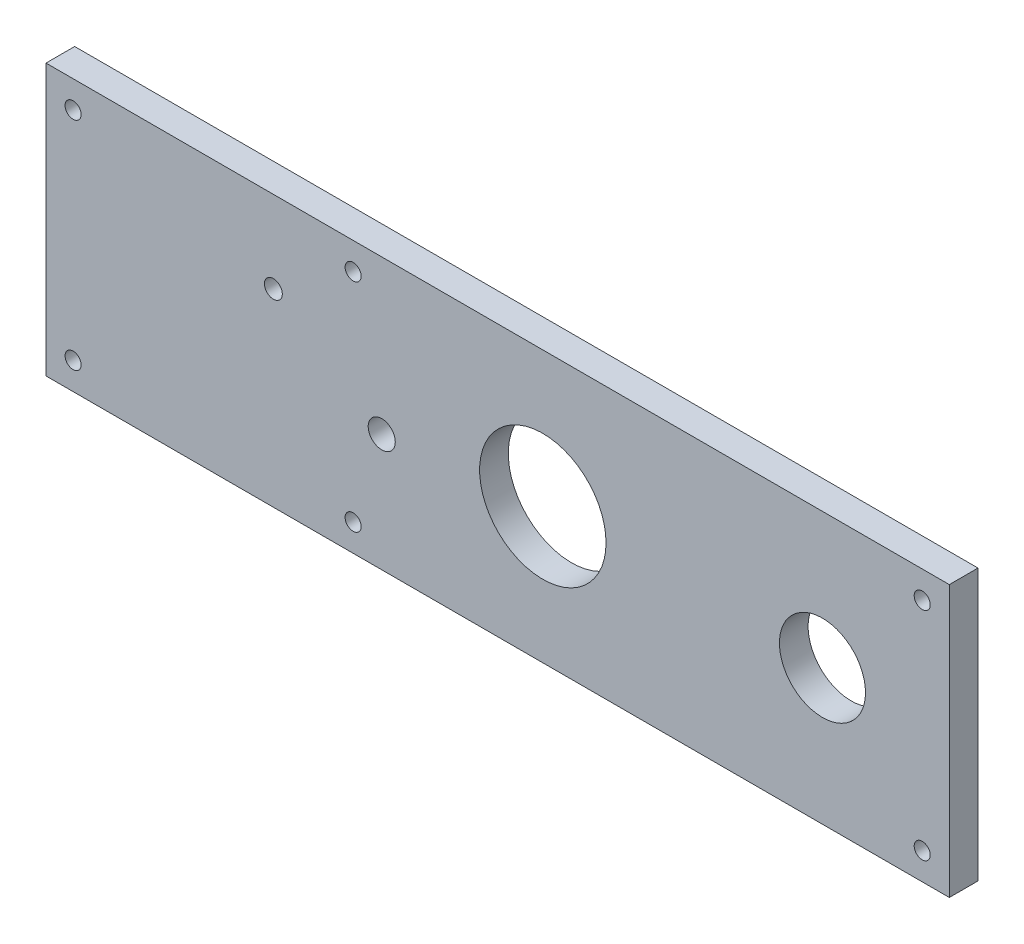
ISO-10303-21;
HEADER;
FILE_DESCRIPTION(('STEP AP214'),'2;1');
FILE_NAME('part.step','',(''),(''),'','','');
FILE_SCHEMA(('AUTOMOTIVE_DESIGN { 1 0 10303 214 1 1 1 1 }'));
ENDSEC;
DATA;
#1=APPLICATION_CONTEXT('core data for automotive mechanical design processes');
#2=APPLICATION_PROTOCOL_DEFINITION('international standard','automotive_design',2000,#1);
#3=PRODUCT_CONTEXT('',#1,'mechanical');
#4=PRODUCT('Part','Part','',(#3));
#5=PRODUCT_RELATED_PRODUCT_CATEGORY('part','',(#4));
#6=PRODUCT_DEFINITION_FORMATION('','',#4);
#7=PRODUCT_DEFINITION_CONTEXT('part definition',#1,'design');
#8=PRODUCT_DEFINITION('design','',#6,#7);
#9=PRODUCT_DEFINITION_SHAPE('','',#8);
#10=(LENGTH_UNIT() NAMED_UNIT(*) SI_UNIT(.MILLI.,.METRE.));
#11=(NAMED_UNIT(*) PLANE_ANGLE_UNIT() SI_UNIT($,.RADIAN.));
#12=(NAMED_UNIT(*) SI_UNIT($,.STERADIAN.) SOLID_ANGLE_UNIT());
#13=UNCERTAINTY_MEASURE_WITH_UNIT(LENGTH_MEASURE(1.E-05),#10,'distance_accuracy_value','');
#14=(GEOMETRIC_REPRESENTATION_CONTEXT(3) GLOBAL_UNCERTAINTY_ASSIGNED_CONTEXT((#13)) GLOBAL_UNIT_ASSIGNED_CONTEXT((#10,
#11,#12)) REPRESENTATION_CONTEXT('',''));
#15=CARTESIAN_POINT('',(0.,0.,0.));
#16=DIRECTION('',(0.,0.,1.));
#17=DIRECTION('',(1.,0.,0.));
#18=AXIS2_PLACEMENT_3D('',#15,#16,#17);
#19=CARTESIAN_POINT('',(0.,0.,3.175));
#20=DIRECTION('',(0.,0.,-1.));
#21=DIRECTION('',(-1.,0.,0.));
#22=AXIS2_PLACEMENT_3D('',#19,#20,#21);
#23=PLANE('',#22);
#24=CARTESIAN_POINT('',(85.9562,15.,3.175));
#25=DIRECTION('',(0.,0.,1.));
#26=DIRECTION('',(1.,0.,0.));
#27=AXIS2_PLACEMENT_3D('',#24,#25,#26);
#28=CIRCLE('',#27,4.7625);
#29=CARTESIAN_POINT('',(90.7187,15.,3.175));
#30=VERTEX_POINT('',#29);
#31=EDGE_CURVE('E165',#30,#30,#28,.T.);
#32=ORIENTED_EDGE('',*,*,#31,.F.);
#33=EDGE_LOOP('',(#32));
#34=FACE_BOUND('',#33,.T.);
#35=CARTESIAN_POINT('',(97.,27.,3.175));
#36=DIRECTION('',(0.,0.,1.));
#37=DIRECTION('',(1.,0.,0.));
#38=AXIS2_PLACEMENT_3D('',#35,#36,#37);
#39=CIRCLE('',#38,0.888999999999987);
#40=CARTESIAN_POINT('',(97.889,27.,3.175));
#41=VERTEX_POINT('',#40);
#42=EDGE_CURVE('E161',#41,#41,#39,.T.);
#43=ORIENTED_EDGE('',*,*,#42,.F.);
#44=EDGE_LOOP('',(#43));
#45=FACE_BOUND('',#44,.T.);
#46=CARTESIAN_POINT('',(97.,3.,3.175));
#47=DIRECTION('',(0.,0.,1.));
#48=DIRECTION('',(1.,0.,0.));
#49=AXIS2_PLACEMENT_3D('',#46,#47,#48);
#50=CIRCLE('',#49,0.888999999999987);
#51=CARTESIAN_POINT('',(97.889,3.,3.175));
#52=VERTEX_POINT('',#51);
#53=EDGE_CURVE('E155',#52,#52,#50,.T.);
#54=ORIENTED_EDGE('',*,*,#53,.F.);
#55=EDGE_LOOP('',(#54));
#56=FACE_BOUND('',#55,.T.);
#57=CARTESIAN_POINT('',(3.,27.,3.175));
#58=DIRECTION('',(0.,0.,1.));
#59=DIRECTION('',(1.,0.,0.));
#60=AXIS2_PLACEMENT_3D('',#57,#58,#59);
#61=CIRCLE('',#60,0.888999999999987);
#62=CARTESIAN_POINT('',(3.88899999999999,27.,3.175));
#63=VERTEX_POINT('',#62);
#64=EDGE_CURVE('E149',#63,#63,#61,.T.);
#65=ORIENTED_EDGE('',*,*,#64,.F.);
#66=EDGE_LOOP('',(#65));
#67=FACE_BOUND('',#66,.T.);
#68=CARTESIAN_POINT('',(3.,3.,3.175));
#69=DIRECTION('',(0.,0.,1.));
#70=DIRECTION('',(1.,0.,0.));
#71=AXIS2_PLACEMENT_3D('',#68,#69,#70);
#72=CIRCLE('',#71,0.888999999999987);
#73=CARTESIAN_POINT('',(3.88899999999999,3.,3.175));
#74=VERTEX_POINT('',#73);
#75=EDGE_CURVE('E143',#74,#74,#72,.T.);
#76=ORIENTED_EDGE('',*,*,#75,.F.);
#77=EDGE_LOOP('',(#76));
#78=FACE_BOUND('',#77,.T.);
#79=CARTESIAN_POINT('',(34.,27.,3.175));
#80=DIRECTION('',(0.,0.,1.));
#81=DIRECTION('',(1.,0.,0.));
#82=AXIS2_PLACEMENT_3D('',#79,#80,#81);
#83=CIRCLE('',#82,0.888999999999987);
#84=CARTESIAN_POINT('',(34.889,27.,3.175));
#85=VERTEX_POINT('',#84);
#86=EDGE_CURVE('E137',#85,#85,#83,.T.);
#87=ORIENTED_EDGE('',*,*,#86,.F.);
#88=EDGE_LOOP('',(#87));
#89=FACE_BOUND('',#88,.T.);
#90=CARTESIAN_POINT('',(34.,3.,3.175));
#91=DIRECTION('',(0.,0.,1.));
#92=DIRECTION('',(1.,0.,0.));
#93=AXIS2_PLACEMENT_3D('',#90,#91,#92);
#94=CIRCLE('',#93,0.888999999999987);
#95=CARTESIAN_POINT('',(34.889,3.,3.175));
#96=VERTEX_POINT('',#95);
#97=EDGE_CURVE('E131',#96,#96,#94,.T.);
#98=ORIENTED_EDGE('',*,*,#97,.F.);
#99=EDGE_LOOP('',(#98));
#100=FACE_BOUND('',#99,.T.);
#101=CARTESIAN_POINT('',(37.1666992956996,13.,3.175));
#102=DIRECTION('',(0.,0.,1.));
#103=DIRECTION('',(1.,0.,0.));
#104=AXIS2_PLACEMENT_3D('',#101,#102,#103);
#105=CIRCLE('',#104,1.49860000000001);
#106=CARTESIAN_POINT('',(38.6652992956997,13.,3.175));
#107=VERTEX_POINT('',#106);
#108=EDGE_CURVE('E114',#107,#107,#105,.T.);
#109=ORIENTED_EDGE('',*,*,#108,.F.);
#110=EDGE_LOOP('',(#109));
#111=FACE_BOUND('',#110,.T.);
#112=DIRECTION('',(0.,-1.,0.));
#113=VECTOR('',#112,1.);
#114=CARTESIAN_POINT('',(0.,0.,3.175));
#115=LINE('',#114,#113);
#116=CARTESIAN_POINT('',(0.,30.,3.175));
#117=VERTEX_POINT('',#116);
#118=CARTESIAN_POINT('',(0.,0.,3.175));
#119=VERTEX_POINT('',#118);
#120=EDGE_CURVE('E84',#117,#119,#115,.T.);
#121=ORIENTED_EDGE('',*,*,#120,.T.);
#122=DIRECTION('',(1.,0.,0.));
#123=VECTOR('',#122,1.);
#124=CARTESIAN_POINT('',(0.,0.,3.175));
#125=LINE('',#124,#123);
#126=CARTESIAN_POINT('',(100.,0.,3.175));
#127=VERTEX_POINT('',#126);
#128=EDGE_CURVE('E79',#119,#127,#125,.T.);
#129=ORIENTED_EDGE('',*,*,#128,.T.);
#130=DIRECTION('',(0.,1.,0.));
#131=VECTOR('',#130,1.);
#132=CARTESIAN_POINT('',(100.,0.,3.175));
#133=LINE('',#132,#131);
#134=CARTESIAN_POINT('',(100.,30.,3.175));
#135=VERTEX_POINT('',#134);
#136=EDGE_CURVE('E82',#127,#135,#133,.T.);
#137=ORIENTED_EDGE('',*,*,#136,.T.);
#138=DIRECTION('',(-1.,0.,0.));
#139=VECTOR('',#138,1.);
#140=CARTESIAN_POINT('',(0.,30.,3.175));
#141=LINE('',#140,#139);
#142=EDGE_CURVE('E49',#135,#117,#141,.T.);
#143=ORIENTED_EDGE('',*,*,#142,.T.);
#144=EDGE_LOOP('',(#121,#129,#137,#143));
#145=FACE_BOUND('',#144,.T.);
#146=CARTESIAN_POINT('',(55.,15.,3.175));
#147=DIRECTION('',(0.,0.,1.));
#148=DIRECTION('',(1.,0.,0.));
#149=AXIS2_PLACEMENT_3D('',#146,#147,#148);
#150=CIRCLE('',#149,6.9977);
#151=CARTESIAN_POINT('',(61.9977,15.,3.175));
#152=VERTEX_POINT('',#151);
#153=EDGE_CURVE('E99',#152,#152,#150,.T.);
#154=ORIENTED_EDGE('',*,*,#153,.F.);
#155=EDGE_LOOP('',(#154));
#156=FACE_BOUND('',#155,.T.);
#157=CARTESIAN_POINT('',(25.1697789659621,20.9334001816327,3.175));
#158=DIRECTION('',(0.,0.,1.));
#159=DIRECTION('',(1.,0.,0.));
#160=AXIS2_PLACEMENT_3D('',#157,#158,#159);
#161=CIRCLE('',#160,0.990600000000001);
#162=CARTESIAN_POINT('',(26.1603789659621,20.9334001816327,3.175));
#163=VERTEX_POINT('',#162);
#164=EDGE_CURVE('E120',#163,#163,#161,.T.);
#165=ORIENTED_EDGE('',*,*,#164,.F.);
#166=EDGE_LOOP('',(#165));
#167=FACE_BOUND('',#166,.T.);
#168=ADVANCED_FACE('F32',(#34,#45,#56,#67,#78,#89,#100,#111,#145,#156,#167),#23,.F.);
#169=CARTESIAN_POINT('',(0.,0.,0.));
#170=DIRECTION('',(0.,0.,-1.));
#171=DIRECTION('',(-1.,0.,0.));
#172=AXIS2_PLACEMENT_3D('',#169,#170,#171);
#173=PLANE('',#172);
#174=CARTESIAN_POINT('',(85.9562,15.,0.));
#175=DIRECTION('',(0.,0.,1.));
#176=DIRECTION('',(1.,0.,0.));
#177=AXIS2_PLACEMENT_3D('',#174,#175,#176);
#178=CIRCLE('',#177,4.7625);
#179=CARTESIAN_POINT('',(90.7187,15.,0.));
#180=VERTEX_POINT('',#179);
#181=EDGE_CURVE('E164',#180,#180,#178,.T.);
#182=ORIENTED_EDGE('',*,*,#181,.T.);
#183=EDGE_LOOP('',(#182));
#184=FACE_BOUND('',#183,.T.);
#185=CARTESIAN_POINT('',(97.,27.,0.));
#186=DIRECTION('',(0.,0.,1.));
#187=DIRECTION('',(1.,0.,0.));
#188=AXIS2_PLACEMENT_3D('',#185,#186,#187);
#189=CIRCLE('',#188,0.889000000000001);
#190=CARTESIAN_POINT('',(97.889,27.,0.));
#191=VERTEX_POINT('',#190);
#192=EDGE_CURVE('E158',#191,#191,#189,.T.);
#193=ORIENTED_EDGE('',*,*,#192,.T.);
#194=EDGE_LOOP('',(#193));
#195=FACE_BOUND('',#194,.T.);
#196=CARTESIAN_POINT('',(97.,3.,0.));
#197=DIRECTION('',(0.,0.,1.));
#198=DIRECTION('',(1.,0.,0.));
#199=AXIS2_PLACEMENT_3D('',#196,#197,#198);
#200=CIRCLE('',#199,0.889000000000001);
#201=CARTESIAN_POINT('',(97.889,3.,0.));
#202=VERTEX_POINT('',#201);
#203=EDGE_CURVE('E152',#202,#202,#200,.T.);
#204=ORIENTED_EDGE('',*,*,#203,.T.);
#205=EDGE_LOOP('',(#204));
#206=FACE_BOUND('',#205,.T.);
#207=CARTESIAN_POINT('',(3.,27.,0.));
#208=DIRECTION('',(0.,0.,1.));
#209=DIRECTION('',(1.,0.,0.));
#210=AXIS2_PLACEMENT_3D('',#207,#208,#209);
#211=CIRCLE('',#210,0.888999999999999);
#212=CARTESIAN_POINT('',(3.889,27.,0.));
#213=VERTEX_POINT('',#212);
#214=EDGE_CURVE('E146',#213,#213,#211,.T.);
#215=ORIENTED_EDGE('',*,*,#214,.T.);
#216=EDGE_LOOP('',(#215));
#217=FACE_BOUND('',#216,.T.);
#218=CARTESIAN_POINT('',(3.,3.,0.));
#219=DIRECTION('',(0.,0.,1.));
#220=DIRECTION('',(1.,0.,0.));
#221=AXIS2_PLACEMENT_3D('',#218,#219,#220);
#222=CIRCLE('',#221,0.888999999999999);
#223=CARTESIAN_POINT('',(3.889,3.,0.));
#224=VERTEX_POINT('',#223);
#225=EDGE_CURVE('E140',#224,#224,#222,.T.);
#226=ORIENTED_EDGE('',*,*,#225,.T.);
#227=EDGE_LOOP('',(#226));
#228=FACE_BOUND('',#227,.T.);
#229=CARTESIAN_POINT('',(34.,27.,0.));
#230=DIRECTION('',(0.,0.,1.));
#231=DIRECTION('',(1.,0.,0.));
#232=AXIS2_PLACEMENT_3D('',#229,#230,#231);
#233=CIRCLE('',#232,0.889000000000001);
#234=CARTESIAN_POINT('',(34.889,27.,0.));
#235=VERTEX_POINT('',#234);
#236=EDGE_CURVE('E134',#235,#235,#233,.T.);
#237=ORIENTED_EDGE('',*,*,#236,.T.);
#238=EDGE_LOOP('',(#237));
#239=FACE_BOUND('',#238,.T.);
#240=CARTESIAN_POINT('',(34.,3.,0.));
#241=DIRECTION('',(0.,0.,1.));
#242=DIRECTION('',(1.,0.,0.));
#243=AXIS2_PLACEMENT_3D('',#240,#241,#242);
#244=CIRCLE('',#243,0.889000000000001);
#245=CARTESIAN_POINT('',(34.889,3.,0.));
#246=VERTEX_POINT('',#245);
#247=EDGE_CURVE('E126',#246,#246,#244,.T.);
#248=ORIENTED_EDGE('',*,*,#247,.T.);
#249=EDGE_LOOP('',(#248));
#250=FACE_BOUND('',#249,.T.);
#251=CARTESIAN_POINT('',(37.1666992956996,13.,0.));
#252=DIRECTION('',(0.,0.,1.));
#253=DIRECTION('',(1.,0.,0.));
#254=AXIS2_PLACEMENT_3D('',#251,#252,#253);
#255=CIRCLE('',#254,1.49860000000001);
#256=CARTESIAN_POINT('',(38.6652992956997,13.,0.));
#257=VERTEX_POINT('',#256);
#258=EDGE_CURVE('E117',#257,#257,#255,.T.);
#259=ORIENTED_EDGE('',*,*,#258,.T.);
#260=EDGE_LOOP('',(#259));
#261=FACE_BOUND('',#260,.T.);
#262=DIRECTION('',(0.,-1.,0.));
#263=VECTOR('',#262,1.);
#264=CARTESIAN_POINT('',(0.,0.,0.));
#265=LINE('',#264,#263);
#266=CARTESIAN_POINT('',(0.,30.,0.));
#267=VERTEX_POINT('',#266);
#268=CARTESIAN_POINT('',(0.,0.,0.));
#269=VERTEX_POINT('',#268);
#270=EDGE_CURVE('E96',#267,#269,#265,.T.);
#271=ORIENTED_EDGE('',*,*,#270,.F.);
#272=DIRECTION('',(-1.,0.,0.));
#273=VECTOR('',#272,1.);
#274=CARTESIAN_POINT('',(0.,30.,0.));
#275=LINE('',#274,#273);
#276=CARTESIAN_POINT('',(100.,30.,0.));
#277=VERTEX_POINT('',#276);
#278=EDGE_CURVE('E72',#277,#267,#275,.T.);
#279=ORIENTED_EDGE('',*,*,#278,.F.);
#280=DIRECTION('',(0.,1.,0.));
#281=VECTOR('',#280,1.);
#282=CARTESIAN_POINT('',(100.,0.,0.));
#283=LINE('',#282,#281);
#284=CARTESIAN_POINT('',(100.,0.,0.));
#285=VERTEX_POINT('',#284);
#286=EDGE_CURVE('E66',#285,#277,#283,.T.);
#287=ORIENTED_EDGE('',*,*,#286,.F.);
#288=DIRECTION('',(1.,0.,0.));
#289=VECTOR('',#288,1.);
#290=CARTESIAN_POINT('',(0.,0.,0.));
#291=LINE('',#290,#289);
#292=EDGE_CURVE('E88',#269,#285,#291,.T.);
#293=ORIENTED_EDGE('',*,*,#292,.F.);
#294=EDGE_LOOP('',(#271,#279,#287,#293));
#295=FACE_BOUND('',#294,.T.);
#296=CARTESIAN_POINT('',(55.,15.,0.));
#297=DIRECTION('',(0.,0.,1.));
#298=DIRECTION('',(1.,0.,0.));
#299=AXIS2_PLACEMENT_3D('',#296,#297,#298);
#300=CIRCLE('',#299,6.9977);
#301=CARTESIAN_POINT('',(61.9977,15.,0.));
#302=VERTEX_POINT('',#301);
#303=EDGE_CURVE('E111',#302,#302,#300,.T.);
#304=ORIENTED_EDGE('',*,*,#303,.T.);
#305=EDGE_LOOP('',(#304));
#306=FACE_BOUND('',#305,.T.);
#307=CARTESIAN_POINT('',(25.1697789659621,20.9334001816327,0.));
#308=DIRECTION('',(0.,0.,1.));
#309=DIRECTION('',(1.,0.,0.));
#310=AXIS2_PLACEMENT_3D('',#307,#308,#309);
#311=CIRCLE('',#310,0.990600000000001);
#312=CARTESIAN_POINT('',(26.1603789659621,20.9334001816327,0.));
#313=VERTEX_POINT('',#312);
#314=EDGE_CURVE('E123',#313,#313,#311,.T.);
#315=ORIENTED_EDGE('',*,*,#314,.T.);
#316=EDGE_LOOP('',(#315));
#317=FACE_BOUND('',#316,.T.);
#318=ADVANCED_FACE('F107',(#184,#195,#206,#217,#228,#239,#250,#261,#295,#306,#317),#173,.T.);
#319=CARTESIAN_POINT('',(0.,0.,3.175));
#320=DIRECTION('',(1.,0.,0.));
#321=DIRECTION('',(0.,0.,-1.));
#322=AXIS2_PLACEMENT_3D('',#319,#320,#321);
#323=PLANE('',#322);
#324=ORIENTED_EDGE('',*,*,#270,.T.);
#325=DIRECTION('',(0.,0.,-1.));
#326=VECTOR('',#325,1.);
#327=CARTESIAN_POINT('',(0.,0.,3.175));
#328=LINE('',#327,#326);
#329=EDGE_CURVE('E11',#119,#269,#328,.T.);
#330=ORIENTED_EDGE('',*,*,#329,.F.);
#331=ORIENTED_EDGE('',*,*,#120,.F.);
#332=DIRECTION('',(0.,0.,-1.));
#333=VECTOR('',#332,1.);
#334=CARTESIAN_POINT('',(0.,30.,3.175));
#335=LINE('',#334,#333);
#336=EDGE_CURVE('E92',#117,#267,#335,.T.);
#337=ORIENTED_EDGE('',*,*,#336,.T.);
#338=EDGE_LOOP('',(#324,#330,#331,#337));
#339=FACE_BOUND('',#338,.T.);
#340=ADVANCED_FACE('F34',(#339),#323,.F.);
#341=CARTESIAN_POINT('',(0.,0.,3.175));
#342=DIRECTION('',(0.,1.,0.));
#343=DIRECTION('',(-1.,0.,0.));
#344=AXIS2_PLACEMENT_3D('',#341,#342,#343);
#345=PLANE('',#344);
#346=ORIENTED_EDGE('',*,*,#292,.T.);
#347=DIRECTION('',(0.,0.,-1.));
#348=VECTOR('',#347,1.);
#349=CARTESIAN_POINT('',(100.,0.,3.175));
#350=LINE('',#349,#348);
#351=EDGE_CURVE('E41',#127,#285,#350,.T.);
#352=ORIENTED_EDGE('',*,*,#351,.F.);
#353=ORIENTED_EDGE('',*,*,#128,.F.);
#354=ORIENTED_EDGE('',*,*,#329,.T.);
#355=EDGE_LOOP('',(#346,#352,#353,#354));
#356=FACE_BOUND('',#355,.T.);
#357=ADVANCED_FACE('F87',(#356),#345,.F.);
#358=CARTESIAN_POINT('',(100.,0.,3.175));
#359=DIRECTION('',(-1.,0.,0.));
#360=DIRECTION('',(0.,0.,1.));
#361=AXIS2_PLACEMENT_3D('',#358,#359,#360);
#362=PLANE('',#361);
#363=ORIENTED_EDGE('',*,*,#286,.T.);
#364=DIRECTION('',(0.,0.,-1.));
#365=VECTOR('',#364,1.);
#366=CARTESIAN_POINT('',(100.,30.,3.175));
#367=LINE('',#366,#365);
#368=EDGE_CURVE('E89',#135,#277,#367,.T.);
#369=ORIENTED_EDGE('',*,*,#368,.F.);
#370=ORIENTED_EDGE('',*,*,#136,.F.);
#371=ORIENTED_EDGE('',*,*,#351,.T.);
#372=EDGE_LOOP('',(#363,#369,#370,#371));
#373=FACE_BOUND('',#372,.T.);
#374=ADVANCED_FACE('F90',(#373),#362,.F.);
#375=CARTESIAN_POINT('',(0.,30.,3.175));
#376=DIRECTION('',(0.,-1.,0.));
#377=DIRECTION('',(1.,0.,0.));
#378=AXIS2_PLACEMENT_3D('',#375,#376,#377);
#379=PLANE('',#378);
#380=ORIENTED_EDGE('',*,*,#278,.T.);
#381=ORIENTED_EDGE('',*,*,#336,.F.);
#382=ORIENTED_EDGE('',*,*,#142,.F.);
#383=ORIENTED_EDGE('',*,*,#368,.T.);
#384=EDGE_LOOP('',(#380,#381,#382,#383));
#385=FACE_BOUND('',#384,.T.);
#386=ADVANCED_FACE('F104',(#385),#379,.F.);
#387=CARTESIAN_POINT('',(55.,15.,3.175));
#388=DIRECTION('',(0.,0.,-1.));
#389=DIRECTION('',(-1.,0.,0.));
#390=AXIS2_PLACEMENT_3D('',#387,#388,#389);
#391=CYLINDRICAL_SURFACE('',#390,6.9977);
#392=ORIENTED_EDGE('',*,*,#153,.T.);
#393=EDGE_LOOP('',(#392));
#394=FACE_BOUND('',#393,.T.);
#395=ORIENTED_EDGE('',*,*,#303,.F.);
#396=EDGE_LOOP('',(#395));
#397=FACE_BOUND('',#396,.T.);
#398=ADVANCED_FACE('F201',(#394,#397),#391,.F.);
#399=CARTESIAN_POINT('',(37.1666992956996,13.,3.175));
#400=DIRECTION('',(0.,0.,-1.));
#401=DIRECTION('',(-1.,0.,0.));
#402=AXIS2_PLACEMENT_3D('',#399,#400,#401);
#403=CYLINDRICAL_SURFACE('',#402,1.49860000000001);
#404=ORIENTED_EDGE('',*,*,#108,.T.);
#405=EDGE_LOOP('',(#404));
#406=FACE_BOUND('',#405,.T.);
#407=ORIENTED_EDGE('',*,*,#258,.F.);
#408=EDGE_LOOP('',(#407));
#409=FACE_BOUND('',#408,.T.);
#410=ADVANCED_FACE('F197',(#406,#409),#403,.F.);
#411=CARTESIAN_POINT('',(25.1697789659621,20.9334001816327,3.175));
#412=DIRECTION('',(0.,0.,-1.));
#413=DIRECTION('',(-1.,0.,0.));
#414=AXIS2_PLACEMENT_3D('',#411,#412,#413);
#415=CYLINDRICAL_SURFACE('',#414,0.990600000000001);
#416=ORIENTED_EDGE('',*,*,#164,.T.);
#417=EDGE_LOOP('',(#416));
#418=FACE_BOUND('',#417,.T.);
#419=ORIENTED_EDGE('',*,*,#314,.F.);
#420=EDGE_LOOP('',(#419));
#421=FACE_BOUND('',#420,.T.);
#422=ADVANCED_FACE('F200',(#418,#421),#415,.F.);
#423=CARTESIAN_POINT('',(34.,3.,3.175));
#424=DIRECTION('',(0.,0.,1.));
#425=DIRECTION('',(1.,0.,0.));
#426=AXIS2_PLACEMENT_3D('',#423,#424,#425);
#427=CYLINDRICAL_SURFACE('',#426,0.888999999999994);
#428=ORIENTED_EDGE('',*,*,#247,.F.);
#429=EDGE_LOOP('',(#428));
#430=FACE_BOUND('',#429,.T.);
#431=ORIENTED_EDGE('',*,*,#97,.T.);
#432=EDGE_LOOP('',(#431));
#433=FACE_BOUND('',#432,.T.);
#434=ADVANCED_FACE('F244',(#430,#433),#427,.F.);
#435=CARTESIAN_POINT('',(34.,27.,3.175));
#436=DIRECTION('',(0.,0.,1.));
#437=DIRECTION('',(1.,0.,0.));
#438=AXIS2_PLACEMENT_3D('',#435,#436,#437);
#439=CYLINDRICAL_SURFACE('',#438,0.888999999999994);
#440=ORIENTED_EDGE('',*,*,#236,.F.);
#441=EDGE_LOOP('',(#440));
#442=FACE_BOUND('',#441,.T.);
#443=ORIENTED_EDGE('',*,*,#86,.T.);
#444=EDGE_LOOP('',(#443));
#445=FACE_BOUND('',#444,.T.);
#446=ADVANCED_FACE('F252',(#442,#445),#439,.F.);
#447=CARTESIAN_POINT('',(3.,3.,3.175));
#448=DIRECTION('',(0.,0.,1.));
#449=DIRECTION('',(1.,0.,0.));
#450=AXIS2_PLACEMENT_3D('',#447,#448,#449);
#451=CYLINDRICAL_SURFACE('',#450,0.888999999999993);
#452=ORIENTED_EDGE('',*,*,#225,.F.);
#453=EDGE_LOOP('',(#452));
#454=FACE_BOUND('',#453,.T.);
#455=ORIENTED_EDGE('',*,*,#75,.T.);
#456=EDGE_LOOP('',(#455));
#457=FACE_BOUND('',#456,.T.);
#458=ADVANCED_FACE('F260',(#454,#457),#451,.F.);
#459=CARTESIAN_POINT('',(3.,27.,3.175));
#460=DIRECTION('',(0.,0.,1.));
#461=DIRECTION('',(1.,0.,0.));
#462=AXIS2_PLACEMENT_3D('',#459,#460,#461);
#463=CYLINDRICAL_SURFACE('',#462,0.888999999999993);
#464=ORIENTED_EDGE('',*,*,#214,.F.);
#465=EDGE_LOOP('',(#464));
#466=FACE_BOUND('',#465,.T.);
#467=ORIENTED_EDGE('',*,*,#64,.T.);
#468=EDGE_LOOP('',(#467));
#469=FACE_BOUND('',#468,.T.);
#470=ADVANCED_FACE('F268',(#466,#469),#463,.F.);
#471=CARTESIAN_POINT('',(97.,3.,3.175));
#472=DIRECTION('',(0.,0.,1.));
#473=DIRECTION('',(1.,0.,0.));
#474=AXIS2_PLACEMENT_3D('',#471,#472,#473);
#475=CYLINDRICAL_SURFACE('',#474,0.888999999999994);
#476=ORIENTED_EDGE('',*,*,#203,.F.);
#477=EDGE_LOOP('',(#476));
#478=FACE_BOUND('',#477,.T.);
#479=ORIENTED_EDGE('',*,*,#53,.T.);
#480=EDGE_LOOP('',(#479));
#481=FACE_BOUND('',#480,.T.);
#482=ADVANCED_FACE('F276',(#478,#481),#475,.F.);
#483=CARTESIAN_POINT('',(97.,27.,3.175));
#484=DIRECTION('',(0.,0.,1.));
#485=DIRECTION('',(1.,0.,0.));
#486=AXIS2_PLACEMENT_3D('',#483,#484,#485);
#487=CYLINDRICAL_SURFACE('',#486,0.888999999999994);
#488=ORIENTED_EDGE('',*,*,#192,.F.);
#489=EDGE_LOOP('',(#488));
#490=FACE_BOUND('',#489,.T.);
#491=ORIENTED_EDGE('',*,*,#42,.T.);
#492=EDGE_LOOP('',(#491));
#493=FACE_BOUND('',#492,.T.);
#494=ADVANCED_FACE('F176',(#490,#493),#487,.F.);
#495=CARTESIAN_POINT('',(85.9562,15.,0.));
#496=DIRECTION('',(0.,0.,1.));
#497=DIRECTION('',(1.,0.,0.));
#498=AXIS2_PLACEMENT_3D('',#495,#496,#497);
#499=CYLINDRICAL_SURFACE('',#498,4.7625);
#500=ORIENTED_EDGE('',*,*,#181,.F.);
#501=EDGE_LOOP('',(#500));
#502=FACE_BOUND('',#501,.T.);
#503=ORIENTED_EDGE('',*,*,#31,.T.);
#504=EDGE_LOOP('',(#503));
#505=FACE_BOUND('',#504,.T.);
#506=ADVANCED_FACE('F173',(#502,#505),#499,.F.);
#507=CLOSED_SHELL('',(#168,#318,#340,#357,#374,#386,#398,#410,#422,#434,#446,#458,#470,#482,
#494,#506));
#508=MANIFOLD_SOLID_BREP('B2',#507);
#509=ADVANCED_BREP_SHAPE_REPRESENTATION('',(#18,#508),#14);
#510=SHAPE_DEFINITION_REPRESENTATION(#9,#509);
ENDSEC;
END-ISO-10303-21;
